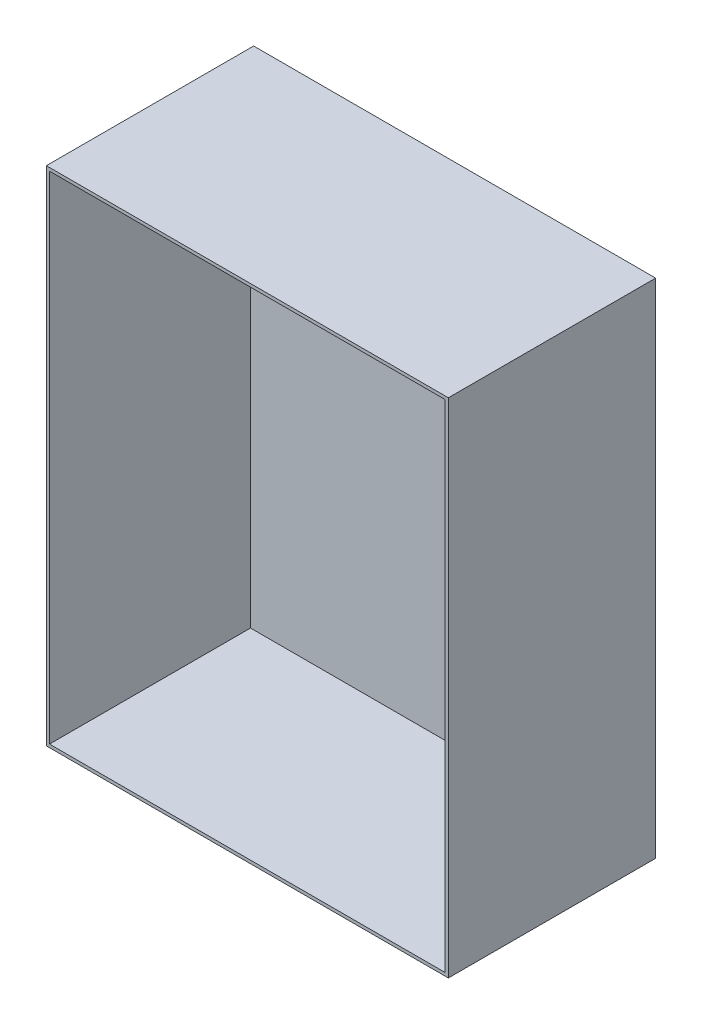
ISO-10303-21;
HEADER;
FILE_DESCRIPTION(('STEP AP214'),'2;1');
FILE_NAME('part.step','',(''),(''),'','','');
FILE_SCHEMA(('AUTOMOTIVE_DESIGN { 1 0 10303 214 1 1 1 1 }'));
ENDSEC;
DATA;
#1=APPLICATION_CONTEXT('core data for automotive mechanical design processes');
#2=APPLICATION_PROTOCOL_DEFINITION('international standard','automotive_design',2000,#1);
#3=PRODUCT_CONTEXT('',#1,'mechanical');
#4=PRODUCT('Part','Part','',(#3));
#5=PRODUCT_RELATED_PRODUCT_CATEGORY('part','',(#4));
#6=PRODUCT_DEFINITION_FORMATION('','',#4);
#7=PRODUCT_DEFINITION_CONTEXT('part definition',#1,'design');
#8=PRODUCT_DEFINITION('design','',#6,#7);
#9=PRODUCT_DEFINITION_SHAPE('','',#8);
#10=(LENGTH_UNIT() NAMED_UNIT(*) SI_UNIT(.MILLI.,.METRE.));
#11=(NAMED_UNIT(*) PLANE_ANGLE_UNIT() SI_UNIT($,.RADIAN.));
#12=(NAMED_UNIT(*) SI_UNIT($,.STERADIAN.) SOLID_ANGLE_UNIT());
#13=UNCERTAINTY_MEASURE_WITH_UNIT(LENGTH_MEASURE(1.E-05),#10,'distance_accuracy_value','');
#14=(GEOMETRIC_REPRESENTATION_CONTEXT(3) GLOBAL_UNCERTAINTY_ASSIGNED_CONTEXT((#13)) GLOBAL_UNIT_ASSIGNED_CONTEXT((#10,
#11,#12)) REPRESENTATION_CONTEXT('',''));
#15=CARTESIAN_POINT('',(0.,0.,0.));
#16=DIRECTION('',(0.,0.,1.));
#17=DIRECTION('',(1.,0.,0.));
#18=AXIS2_PLACEMENT_3D('',#15,#16,#17);
#19=CARTESIAN_POINT('',(0.,0.,1.5875));
#20=DIRECTION('',(-1.,0.,0.));
#21=DIRECTION('',(0.,0.,1.));
#22=AXIS2_PLACEMENT_3D('',#19,#20,#21);
#23=PLANE('',#22);
#24=DIRECTION('',(0.,1.,0.));
#25=VECTOR('',#24,1.);
#26=CARTESIAN_POINT('',(0.,0.,0.));
#27=LINE('',#26,#25);
#28=CARTESIAN_POINT('',(0.,0.,0.));
#29=VERTEX_POINT('',#28);
#30=CARTESIAN_POINT('',(0.,127.,0.));
#31=VERTEX_POINT('',#30);
#32=EDGE_CURVE('E191',#29,#31,#27,.T.);
#33=ORIENTED_EDGE('',*,*,#32,.T.);
#34=DIRECTION('',(0.,0.,-1.));
#35=VECTOR('',#34,1.);
#36=CARTESIAN_POINT('',(0.,127.,1.5875));
#37=LINE('',#36,#35);
#38=CARTESIAN_POINT('',(0.,127.,52.3875));
#39=VERTEX_POINT('',#38);
#40=EDGE_CURVE('E12',#39,#31,#37,.T.);
#41=ORIENTED_EDGE('',*,*,#40,.F.);
#42=DIRECTION('',(0.,1.,0.));
#43=VECTOR('',#42,1.);
#44=CARTESIAN_POINT('',(0.,127.,52.3875));
#45=LINE('',#44,#43);
#46=CARTESIAN_POINT('',(0.,0.,52.3875));
#47=VERTEX_POINT('',#46);
#48=EDGE_CURVE('E183',#47,#39,#45,.T.);
#49=ORIENTED_EDGE('',*,*,#48,.F.);
#50=DIRECTION('',(0.,0.,-1.));
#51=VECTOR('',#50,1.);
#52=CARTESIAN_POINT('',(0.,0.,1.5875));
#53=LINE('',#52,#51);
#54=EDGE_CURVE('E204',#47,#29,#53,.T.);
#55=ORIENTED_EDGE('',*,*,#54,.T.);
#56=EDGE_LOOP('',(#33,#41,#49,#55));
#57=FACE_BOUND('',#56,.T.);
#58=ADVANCED_FACE('F63',(#57),#23,.F.);
#59=CARTESIAN_POINT('',(0.,127.,1.5875));
#60=DIRECTION('',(0.,-1.,0.));
#61=DIRECTION('',(0.,0.,-1.));
#62=AXIS2_PLACEMENT_3D('',#59,#60,#61);
#63=PLANE('',#62);
#64=DIRECTION('',(-1.,0.,0.));
#65=VECTOR('',#64,1.);
#66=CARTESIAN_POINT('',(0.,127.,0.));
#67=LINE('',#66,#65);
#68=CARTESIAN_POINT('',(-101.6,127.,0.));
#69=VERTEX_POINT('',#68);
#70=EDGE_CURVE('E195',#31,#69,#67,.T.);
#71=ORIENTED_EDGE('',*,*,#70,.T.);
#72=DIRECTION('',(0.,0.,-1.));
#73=VECTOR('',#72,1.);
#74=CARTESIAN_POINT('',(-101.6,127.,1.5875));
#75=LINE('',#74,#73);
#76=CARTESIAN_POINT('',(-101.6,127.,52.3875));
#77=VERTEX_POINT('',#76);
#78=EDGE_CURVE('E71',#77,#69,#75,.T.);
#79=ORIENTED_EDGE('',*,*,#78,.F.);
#80=DIRECTION('',(-1.,0.,0.));
#81=VECTOR('',#80,1.);
#82=CARTESIAN_POINT('',(-101.6,127.,52.3875));
#83=LINE('',#82,#81);
#84=EDGE_CURVE('E187',#39,#77,#83,.T.);
#85=ORIENTED_EDGE('',*,*,#84,.F.);
#86=ORIENTED_EDGE('',*,*,#40,.T.);
#87=EDGE_LOOP('',(#71,#79,#85,#86));
#88=FACE_BOUND('',#87,.T.);
#89=ADVANCED_FACE('F229',(#88),#63,.F.);
#90=CARTESIAN_POINT('',(-101.6,0.,1.5875));
#91=DIRECTION('',(1.,0.,0.));
#92=DIRECTION('',(0.,0.,-1.));
#93=AXIS2_PLACEMENT_3D('',#90,#91,#92);
#94=PLANE('',#93);
#95=DIRECTION('',(0.,-1.,0.));
#96=VECTOR('',#95,1.);
#97=CARTESIAN_POINT('',(-101.6,0.,0.));
#98=LINE('',#97,#96);
#99=CARTESIAN_POINT('',(-101.6,0.,0.));
#100=VERTEX_POINT('',#99);
#101=EDGE_CURVE('E198',#69,#100,#98,.T.);
#102=ORIENTED_EDGE('',*,*,#101,.T.);
#103=DIRECTION('',(0.,0.,-1.));
#104=VECTOR('',#103,1.);
#105=CARTESIAN_POINT('',(-101.6,0.,1.5875));
#106=LINE('',#105,#104);
#107=CARTESIAN_POINT('',(-101.6,0.,52.3875));
#108=VERTEX_POINT('',#107);
#109=EDGE_CURVE('E208',#108,#100,#106,.T.);
#110=ORIENTED_EDGE('',*,*,#109,.F.);
#111=DIRECTION('',(0.,-1.,0.));
#112=VECTOR('',#111,1.);
#113=CARTESIAN_POINT('',(-101.6,127.,52.3875));
#114=LINE('',#113,#112);
#115=EDGE_CURVE('E144',#77,#108,#114,.T.);
#116=ORIENTED_EDGE('',*,*,#115,.F.);
#117=ORIENTED_EDGE('',*,*,#78,.T.);
#118=EDGE_LOOP('',(#102,#110,#116,#117));
#119=FACE_BOUND('',#118,.T.);
#120=ADVANCED_FACE('F216',(#119),#94,.F.);
#121=CARTESIAN_POINT('',(0.,0.,1.5875));
#122=DIRECTION('',(0.,1.,0.));
#123=DIRECTION('',(-1.,0.,0.));
#124=AXIS2_PLACEMENT_3D('',#121,#122,#123);
#125=PLANE('',#124);
#126=DIRECTION('',(1.,0.,0.));
#127=VECTOR('',#126,1.);
#128=CARTESIAN_POINT('',(0.,0.,0.));
#129=LINE('',#128,#127);
#130=EDGE_CURVE('E201',#100,#29,#129,.T.);
#131=ORIENTED_EDGE('',*,*,#130,.T.);
#132=ORIENTED_EDGE('',*,*,#54,.F.);
#133=DIRECTION('',(1.,0.,0.));
#134=VECTOR('',#133,1.);
#135=CARTESIAN_POINT('',(-101.6,0.,52.3875));
#136=LINE('',#135,#134);
#137=EDGE_CURVE('E179',#108,#47,#136,.T.);
#138=ORIENTED_EDGE('',*,*,#137,.F.);
#139=ORIENTED_EDGE('',*,*,#109,.T.);
#140=EDGE_LOOP('',(#131,#132,#138,#139));
#141=FACE_BOUND('',#140,.T.);
#142=ADVANCED_FACE('F224',(#141),#125,.F.);
#143=CARTESIAN_POINT('',(0.,0.,0.));
#144=DIRECTION('',(0.,0.,1.));
#145=DIRECTION('',(1.,0.,0.));
#146=AXIS2_PLACEMENT_3D('',#143,#144,#145);
#147=PLANE('',#146);
#148=ORIENTED_EDGE('',*,*,#32,.F.);
#149=ORIENTED_EDGE('',*,*,#130,.F.);
#150=ORIENTED_EDGE('',*,*,#101,.F.);
#151=ORIENTED_EDGE('',*,*,#70,.F.);
#152=EDGE_LOOP('',(#148,#149,#150,#151));
#153=FACE_BOUND('',#152,.T.);
#154=ADVANCED_FACE('F222',(#153),#147,.F.);
#155=CARTESIAN_POINT('',(0.,0.,52.3875));
#156=DIRECTION('',(0.,0.,1.));
#157=DIRECTION('',(1.,0.,0.));
#158=AXIS2_PLACEMENT_3D('',#155,#156,#157);
#159=PLANE('',#158);
#160=ORIENTED_EDGE('',*,*,#115,.T.);
#161=ORIENTED_EDGE('',*,*,#137,.T.);
#162=ORIENTED_EDGE('',*,*,#48,.T.);
#163=ORIENTED_EDGE('',*,*,#84,.T.);
#164=EDGE_LOOP('',(#160,#161,#162,#163));
#165=FACE_BOUND('',#164,.T.);
#166=DIRECTION('',(1.,0.,0.));
#167=VECTOR('',#166,1.);
#168=CARTESIAN_POINT('',(-101.6,0.79375,52.3875));
#169=LINE('',#168,#167);
#170=CARTESIAN_POINT('',(-100.80625,0.79375,52.3875));
#171=VERTEX_POINT('',#170);
#172=CARTESIAN_POINT('',(-0.79375,0.79375,52.3875));
#173=VERTEX_POINT('',#172);
#174=EDGE_CURVE('E137',#171,#173,#169,.T.);
#175=ORIENTED_EDGE('',*,*,#174,.F.);
#176=DIRECTION('',(0.,-1.,0.));
#177=VECTOR('',#176,1.);
#178=CARTESIAN_POINT('',(-100.80625,127.,52.3875));
#179=LINE('',#178,#177);
#180=CARTESIAN_POINT('',(-100.80625,126.20625,52.3875));
#181=VERTEX_POINT('',#180);
#182=EDGE_CURVE('E127',#181,#171,#179,.T.);
#183=ORIENTED_EDGE('',*,*,#182,.F.);
#184=DIRECTION('',(-1.,0.,0.));
#185=VECTOR('',#184,1.);
#186=CARTESIAN_POINT('',(-101.6,126.20625,52.3875));
#187=LINE('',#186,#185);
#188=CARTESIAN_POINT('',(-0.793749999999994,126.20625,52.3875));
#189=VERTEX_POINT('',#188);
#190=EDGE_CURVE('E154',#189,#181,#187,.T.);
#191=ORIENTED_EDGE('',*,*,#190,.F.);
#192=DIRECTION('',(0.,1.,0.));
#193=VECTOR('',#192,1.);
#194=CARTESIAN_POINT('',(-0.793749999999994,127.,52.3875));
#195=LINE('',#194,#193);
#196=EDGE_CURVE('E150',#173,#189,#195,.T.);
#197=ORIENTED_EDGE('',*,*,#196,.F.);
#198=EDGE_LOOP('',(#175,#183,#191,#197));
#199=FACE_BOUND('',#198,.T.);
#200=ADVANCED_FACE('F148',(#165,#199),#159,.T.);
#201=CARTESIAN_POINT('',(-100.80625,127.,52.3875));
#202=DIRECTION('',(1.,0.,0.));
#203=DIRECTION('',(0.,1.,0.));
#204=AXIS2_PLACEMENT_3D('',#201,#202,#203);
#205=PLANE('',#204);
#206=DIRECTION('',(0.,-1.,0.));
#207=VECTOR('',#206,1.);
#208=CARTESIAN_POINT('',(-100.80625,127.,1.5875));
#209=LINE('',#208,#207);
#210=CARTESIAN_POINT('',(-100.80625,126.20625,1.5875));
#211=VERTEX_POINT('',#210);
#212=CARTESIAN_POINT('',(-100.80625,0.79375,1.5875));
#213=VERTEX_POINT('',#212);
#214=EDGE_CURVE('E78',#211,#213,#209,.T.);
#215=ORIENTED_EDGE('',*,*,#214,.F.);
#216=DIRECTION('',(0.,0.,-1.));
#217=VECTOR('',#216,1.);
#218=CARTESIAN_POINT('',(-100.80625,126.20625,52.3875));
#219=LINE('',#218,#217);
#220=EDGE_CURVE('E132',#181,#211,#219,.T.);
#221=ORIENTED_EDGE('',*,*,#220,.F.);
#222=ORIENTED_EDGE('',*,*,#182,.T.);
#223=DIRECTION('',(0.,0.,-1.));
#224=VECTOR('',#223,1.);
#225=CARTESIAN_POINT('',(-100.80625,0.79375,52.3875));
#226=LINE('',#225,#224);
#227=EDGE_CURVE('E130',#171,#213,#226,.T.);
#228=ORIENTED_EDGE('',*,*,#227,.T.);
#229=EDGE_LOOP('',(#215,#221,#222,#228));
#230=FACE_BOUND('',#229,.T.);
#231=ADVANCED_FACE('F129',(#230),#205,.T.);
#232=CARTESIAN_POINT('',(-101.6,0.79375,52.3875));
#233=DIRECTION('',(0.,1.,0.));
#234=DIRECTION('',(0.,0.,1.));
#235=AXIS2_PLACEMENT_3D('',#232,#233,#234);
#236=PLANE('',#235);
#237=DIRECTION('',(1.,0.,0.));
#238=VECTOR('',#237,1.);
#239=CARTESIAN_POINT('',(-101.6,0.79375,1.5875));
#240=LINE('',#239,#238);
#241=CARTESIAN_POINT('',(-0.79375,0.79375,1.5875));
#242=VERTEX_POINT('',#241);
#243=EDGE_CURVE('E82',#213,#242,#240,.T.);
#244=ORIENTED_EDGE('',*,*,#243,.F.);
#245=ORIENTED_EDGE('',*,*,#227,.F.);
#246=ORIENTED_EDGE('',*,*,#174,.T.);
#247=DIRECTION('',(0.,0.,-1.));
#248=VECTOR('',#247,1.);
#249=CARTESIAN_POINT('',(-0.79375,0.79375,52.3875));
#250=LINE('',#249,#248);
#251=EDGE_CURVE('E145',#173,#242,#250,.T.);
#252=ORIENTED_EDGE('',*,*,#251,.T.);
#253=EDGE_LOOP('',(#244,#245,#246,#252));
#254=FACE_BOUND('',#253,.T.);
#255=ADVANCED_FACE('F141',(#254),#236,.T.);
#256=CARTESIAN_POINT('',(-0.793749999999994,127.,52.3875));
#257=DIRECTION('',(-1.,0.,0.));
#258=DIRECTION('',(0.,-1.,0.));
#259=AXIS2_PLACEMENT_3D('',#256,#257,#258);
#260=PLANE('',#259);
#261=DIRECTION('',(0.,1.,0.));
#262=VECTOR('',#261,1.);
#263=CARTESIAN_POINT('',(-0.793749999999994,127.,1.5875));
#264=LINE('',#263,#262);
#265=CARTESIAN_POINT('',(-0.793749999999994,126.20625,1.5875));
#266=VERTEX_POINT('',#265);
#267=EDGE_CURVE('E163',#242,#266,#264,.T.);
#268=ORIENTED_EDGE('',*,*,#267,.F.);
#269=ORIENTED_EDGE('',*,*,#251,.F.);
#270=ORIENTED_EDGE('',*,*,#196,.T.);
#271=DIRECTION('',(0.,0.,-1.));
#272=VECTOR('',#271,1.);
#273=CARTESIAN_POINT('',(-0.793749999999994,126.20625,52.3875));
#274=LINE('',#273,#272);
#275=EDGE_CURVE('E170',#189,#266,#274,.T.);
#276=ORIENTED_EDGE('',*,*,#275,.T.);
#277=EDGE_LOOP('',(#268,#269,#270,#276));
#278=FACE_BOUND('',#277,.T.);
#279=ADVANCED_FACE('F251',(#278),#260,.T.);
#280=CARTESIAN_POINT('',(-101.6,126.20625,52.3875));
#281=DIRECTION('',(0.,-1.,0.));
#282=DIRECTION('',(0.,0.,-1.));
#283=AXIS2_PLACEMENT_3D('',#280,#281,#282);
#284=PLANE('',#283);
#285=DIRECTION('',(-1.,0.,0.));
#286=VECTOR('',#285,1.);
#287=CARTESIAN_POINT('',(-101.6,126.20625,1.5875));
#288=LINE('',#287,#286);
#289=EDGE_CURVE('E138',#266,#211,#288,.T.);
#290=ORIENTED_EDGE('',*,*,#289,.F.);
#291=ORIENTED_EDGE('',*,*,#275,.F.);
#292=ORIENTED_EDGE('',*,*,#190,.T.);
#293=ORIENTED_EDGE('',*,*,#220,.T.);
#294=EDGE_LOOP('',(#290,#291,#292,#293));
#295=FACE_BOUND('',#294,.T.);
#296=ADVANCED_FACE('F244',(#295),#284,.T.);
#297=CARTESIAN_POINT('',(0.,0.,1.5875));
#298=DIRECTION('',(0.,0.,1.));
#299=DIRECTION('',(1.,0.,0.));
#300=AXIS2_PLACEMENT_3D('',#297,#298,#299);
#301=PLANE('',#300);
#302=ORIENTED_EDGE('',*,*,#214,.T.);
#303=ORIENTED_EDGE('',*,*,#243,.T.);
#304=ORIENTED_EDGE('',*,*,#267,.T.);
#305=ORIENTED_EDGE('',*,*,#289,.T.);
#306=EDGE_LOOP('',(#302,#303,#304,#305));
#307=FACE_BOUND('',#306,.T.);
#308=ADVANCED_FACE('F241',(#307),#301,.T.);
#309=CLOSED_SHELL('',(#58,#89,#120,#142,#154,#200,#231,#255,#279,#296,#308));
#310=MANIFOLD_SOLID_BREP('B2',#309);
#311=ADVANCED_BREP_SHAPE_REPRESENTATION('',(#18,#310),#14);
#312=SHAPE_DEFINITION_REPRESENTATION(#9,#311);
ENDSEC;
END-ISO-10303-21;
